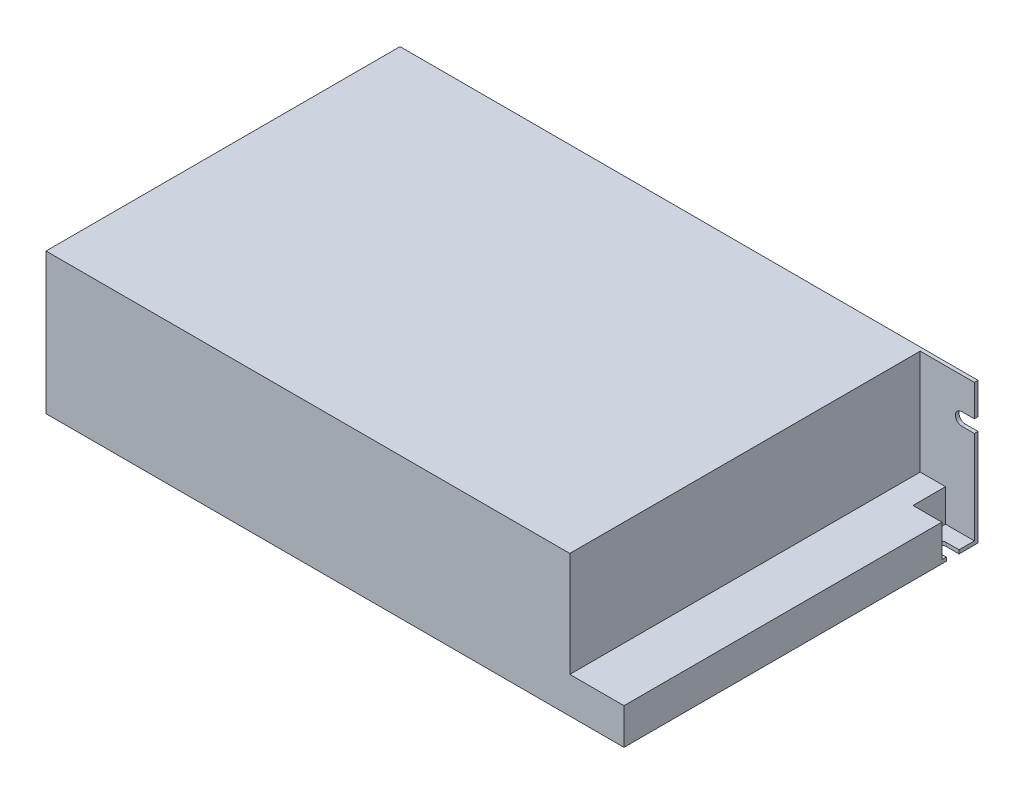
ISO-10303-21;
HEADER;
FILE_DESCRIPTION(('STEP AP214'),'2;1');
FILE_NAME('part.step','',(''),(''),'','','');
FILE_SCHEMA(('AUTOMOTIVE_DESIGN { 1 0 10303 214 1 1 1 1 }'));
ENDSEC;
DATA;
#1=APPLICATION_CONTEXT('core data for automotive mechanical design processes');
#2=APPLICATION_PROTOCOL_DEFINITION('international standard','automotive_design',2000,#1);
#3=PRODUCT_CONTEXT('',#1,'mechanical');
#4=PRODUCT('Part','Part','',(#3));
#5=PRODUCT_RELATED_PRODUCT_CATEGORY('part','',(#4));
#6=PRODUCT_DEFINITION_FORMATION('','',#4);
#7=PRODUCT_DEFINITION_CONTEXT('part definition',#1,'design');
#8=PRODUCT_DEFINITION('design','',#6,#7);
#9=PRODUCT_DEFINITION_SHAPE('','',#8);
#10=(LENGTH_UNIT() NAMED_UNIT(*) SI_UNIT(.MILLI.,.METRE.));
#11=(NAMED_UNIT(*) PLANE_ANGLE_UNIT() SI_UNIT($,.RADIAN.));
#12=(NAMED_UNIT(*) SI_UNIT($,.STERADIAN.) SOLID_ANGLE_UNIT());
#13=UNCERTAINTY_MEASURE_WITH_UNIT(LENGTH_MEASURE(1.E-05),#10,'distance_accuracy_value','');
#14=(GEOMETRIC_REPRESENTATION_CONTEXT(3) GLOBAL_UNCERTAINTY_ASSIGNED_CONTEXT((#13)) GLOBAL_UNIT_ASSIGNED_CONTEXT((#10,
#11,#12)) REPRESENTATION_CONTEXT('',''));
#15=CARTESIAN_POINT('',(0.,0.,0.));
#16=DIRECTION('',(0.,0.,1.));
#17=DIRECTION('',(1.,0.,0.));
#18=AXIS2_PLACEMENT_3D('',#15,#16,#17);
#19=CARTESIAN_POINT('',(80.,39.,-49.));
#20=DIRECTION('',(-1.,0.,0.));
#21=DIRECTION('',(0.,0.,1.));
#22=AXIS2_PLACEMENT_3D('',#19,#20,#21);
#23=PLANE('',#22);
#24=DIRECTION('',(0.,0.,1.));
#25=VECTOR('',#24,1.);
#26=CARTESIAN_POINT('',(80.,0.999999999999999,-48.));
#27=LINE('',#26,#25);
#28=CARTESIAN_POINT('',(80.,0.999999999999999,-40.25));
#29=VERTEX_POINT('',#28);
#30=CARTESIAN_POINT('',(80.,0.999999999999999,-39.));
#31=VERTEX_POINT('',#30);
#32=EDGE_CURVE('E319',#29,#31,#27,.T.);
#33=ORIENTED_EDGE('',*,*,#32,.T.);
#34=DIRECTION('',(0.,1.,0.));
#35=VECTOR('',#34,1.);
#36=CARTESIAN_POINT('',(80.,-12.0415945787923,-39.));
#37=LINE('',#36,#35);
#38=CARTESIAN_POINT('',(80.,10.,-39.));
#39=VERTEX_POINT('',#38);
#40=EDGE_CURVE('E318',#31,#39,#37,.T.);
#41=ORIENTED_EDGE('',*,*,#40,.T.);
#42=DIRECTION('',(0.,0.,-1.));
#43=VECTOR('',#42,1.);
#44=CARTESIAN_POINT('',(80.,10.,49.));
#45=LINE('',#44,#43);
#46=CARTESIAN_POINT('',(80.,10.,49.));
#47=VERTEX_POINT('',#46);
#48=EDGE_CURVE('E279',#47,#39,#45,.T.);
#49=ORIENTED_EDGE('',*,*,#48,.F.);
#50=DIRECTION('',(0.,-1.,0.));
#51=VECTOR('',#50,1.);
#52=CARTESIAN_POINT('',(80.,39.,49.));
#53=LINE('',#52,#51);
#54=CARTESIAN_POINT('',(80.,0.,49.));
#55=VERTEX_POINT('',#54);
#56=EDGE_CURVE('E220',#47,#55,#53,.T.);
#57=ORIENTED_EDGE('',*,*,#56,.T.);
#58=DIRECTION('',(0.,0.,-1.));
#59=VECTOR('',#58,1.);
#60=CARTESIAN_POINT('',(80.,0.,-49.));
#61=LINE('',#60,#59);
#62=CARTESIAN_POINT('',(80.,0.,-40.25));
#63=VERTEX_POINT('',#62);
#64=EDGE_CURVE('E198',#55,#63,#61,.T.);
#65=ORIENTED_EDGE('',*,*,#64,.T.);
#66=DIRECTION('',(0.,-1.,0.));
#67=VECTOR('',#66,1.);
#68=CARTESIAN_POINT('',(80.,5.,-40.25));
#69=LINE('',#68,#67);
#70=EDGE_CURVE('E314',#29,#63,#69,.T.);
#71=ORIENTED_EDGE('',*,*,#70,.F.);
#72=EDGE_LOOP('',(#33,#41,#49,#57,#65,#71));
#73=FACE_BOUND('',#72,.T.);
#74=ADVANCED_FACE('F31',(#73),#23,.F.);
#75=CARTESIAN_POINT('',(76.5,5.,-42.));
#76=DIRECTION('',(0.,-1.,0.));
#77=DIRECTION('',(0.,0.,-1.));
#78=AXIS2_PLACEMENT_3D('',#75,#76,#77);
#79=CYLINDRICAL_SURFACE('',#78,1.74999999999999);
#80=CARTESIAN_POINT('',(76.5,1.,-42.));
#81=DIRECTION('',(0.,1.,0.));
#82=DIRECTION('',(0.,0.,1.));
#83=AXIS2_PLACEMENT_3D('',#80,#81,#82);
#84=CIRCLE('',#83,1.74999999999999);
#85=CARTESIAN_POINT('',(76.5,1.,-40.25));
#86=VERTEX_POINT('',#85);
#87=CARTESIAN_POINT('',(76.5,1.,-43.75));
#88=VERTEX_POINT('',#87);
#89=EDGE_CURVE('E45',#86,#88,#84,.F.);
#90=ORIENTED_EDGE('',*,*,#89,.F.);
#91=DIRECTION('',(0.,-1.,0.));
#92=VECTOR('',#91,1.);
#93=CARTESIAN_POINT('',(76.5,5.,-40.25));
#94=LINE('',#93,#92);
#95=CARTESIAN_POINT('',(76.5,0.,-40.25));
#96=VERTEX_POINT('',#95);
#97=EDGE_CURVE('E338',#86,#96,#94,.T.);
#98=ORIENTED_EDGE('',*,*,#97,.T.);
#99=CARTESIAN_POINT('',(76.5,0.,-42.));
#100=DIRECTION('',(0.,-1.,0.));
#101=DIRECTION('',(0.,0.,-1.));
#102=AXIS2_PLACEMENT_3D('',#99,#100,#101);
#103=CIRCLE('',#102,1.74999999999999);
#104=CARTESIAN_POINT('',(76.5,0.,-43.75));
#105=VERTEX_POINT('',#104);
#106=EDGE_CURVE('E333',#96,#105,#103,.T.);
#107=ORIENTED_EDGE('',*,*,#106,.T.);
#108=DIRECTION('',(0.,-1.,0.));
#109=VECTOR('',#108,1.);
#110=CARTESIAN_POINT('',(76.5,5.,-43.75));
#111=LINE('',#110,#109);
#112=EDGE_CURVE('E52',#88,#105,#111,.T.);
#113=ORIENTED_EDGE('',*,*,#112,.F.);
#114=EDGE_LOOP('',(#90,#98,#107,#113));
#115=FACE_BOUND('',#114,.T.);
#116=ADVANCED_FACE('F406',(#115),#79,.F.);
#117=CARTESIAN_POINT('',(76.5,5.,-40.25));
#118=DIRECTION('',(0.,0.,1.));
#119=DIRECTION('',(1.,0.,0.));
#120=AXIS2_PLACEMENT_3D('',#117,#118,#119);
#121=PLANE('',#120);
#122=DIRECTION('',(-1.,0.,0.));
#123=VECTOR('',#122,1.);
#124=CARTESIAN_POINT('',(76.5,1.,-40.25));
#125=LINE('',#124,#123);
#126=EDGE_CURVE('E331',#29,#86,#125,.T.);
#127=ORIENTED_EDGE('',*,*,#126,.F.);
#128=ORIENTED_EDGE('',*,*,#70,.T.);
#129=DIRECTION('',(-1.,0.,0.));
#130=VECTOR('',#129,1.);
#131=CARTESIAN_POINT('',(76.5,0.,-40.25));
#132=LINE('',#131,#130);
#133=EDGE_CURVE('E310',#63,#96,#132,.T.);
#134=ORIENTED_EDGE('',*,*,#133,.T.);
#135=ORIENTED_EDGE('',*,*,#97,.F.);
#136=EDGE_LOOP('',(#127,#128,#134,#135));
#137=FACE_BOUND('',#136,.T.);
#138=ADVANCED_FACE('F399',(#137),#121,.F.);
#139=CARTESIAN_POINT('',(76.5,5.,-43.75));
#140=DIRECTION('',(0.,0.,-1.));
#141=DIRECTION('',(-1.,0.,0.));
#142=AXIS2_PLACEMENT_3D('',#139,#140,#141);
#143=PLANE('',#142);
#144=DIRECTION('',(1.,0.,0.));
#145=VECTOR('',#144,1.);
#146=CARTESIAN_POINT('',(76.5,1.,-43.75));
#147=LINE('',#146,#145);
#148=CARTESIAN_POINT('',(80.,0.999999999999999,-43.75));
#149=VERTEX_POINT('',#148);
#150=EDGE_CURVE('E12',#88,#149,#147,.T.);
#151=ORIENTED_EDGE('',*,*,#150,.F.);
#152=ORIENTED_EDGE('',*,*,#112,.T.);
#153=DIRECTION('',(1.,0.,0.));
#154=VECTOR('',#153,1.);
#155=CARTESIAN_POINT('',(76.5,0.,-43.75));
#156=LINE('',#155,#154);
#157=CARTESIAN_POINT('',(80.,0.,-43.75));
#158=VERTEX_POINT('',#157);
#159=EDGE_CURVE('E335',#105,#158,#156,.T.);
#160=ORIENTED_EDGE('',*,*,#159,.T.);
#161=DIRECTION('',(0.,-1.,0.));
#162=VECTOR('',#161,1.);
#163=CARTESIAN_POINT('',(80.,5.,-43.75));
#164=LINE('',#163,#162);
#165=EDGE_CURVE('E342',#149,#158,#164,.T.);
#166=ORIENTED_EDGE('',*,*,#165,.F.);
#167=EDGE_LOOP('',(#151,#152,#160,#166));
#168=FACE_BOUND('',#167,.T.);
#169=ADVANCED_FACE('F397',(#168),#143,.F.);
#170=DIRECTION('',(0.,1.,0.));
#171=VECTOR('',#170,1.);
#172=CARTESIAN_POINT('',(80.,39.,-48.));
#173=LINE('',#172,#171);
#174=CARTESIAN_POINT('',(80.,0.999999999999999,-48.));
#175=VERTEX_POINT('',#174);
#176=CARTESIAN_POINT('',(80.,26.75,-48.));
#177=VERTEX_POINT('',#176);
#178=EDGE_CURVE('E231',#175,#177,#173,.T.);
#179=ORIENTED_EDGE('',*,*,#178,.F.);
#180=EDGE_CURVE('E329',#175,#149,#27,.T.);
#181=ORIENTED_EDGE('',*,*,#180,.T.);
#182=ORIENTED_EDGE('',*,*,#165,.T.);
#183=CARTESIAN_POINT('',(80.,0.,-49.));
#184=VERTEX_POINT('',#183);
#185=EDGE_CURVE('E197',#158,#184,#61,.T.);
#186=ORIENTED_EDGE('',*,*,#185,.T.);
#187=DIRECTION('',(0.,-1.,0.));
#188=VECTOR('',#187,1.);
#189=CARTESIAN_POINT('',(80.,39.,-49.));
#190=LINE('',#189,#188);
#191=CARTESIAN_POINT('',(80.,26.75,-49.));
#192=VERTEX_POINT('',#191);
#193=EDGE_CURVE('E216',#192,#184,#190,.T.);
#194=ORIENTED_EDGE('',*,*,#193,.F.);
#195=DIRECTION('',(0.,0.,-1.));
#196=VECTOR('',#195,1.);
#197=CARTESIAN_POINT('',(80.,26.75,-44.));
#198=LINE('',#197,#196);
#199=EDGE_CURVE('E237',#177,#192,#198,.T.);
#200=ORIENTED_EDGE('',*,*,#199,.F.);
#201=EDGE_LOOP('',(#179,#181,#182,#186,#194,#200));
#202=FACE_BOUND('',#201,.T.);
#203=ADVANCED_FACE('F242',(#202),#23,.F.);
#204=CARTESIAN_POINT('',(-80.,39.,-49.));
#205=DIRECTION('',(1.,0.,0.));
#206=DIRECTION('',(0.,0.,-1.));
#207=AXIS2_PLACEMENT_3D('',#204,#205,#206);
#208=PLANE('',#207);
#209=DIRECTION('',(0.,0.,1.));
#210=VECTOR('',#209,1.);
#211=CARTESIAN_POINT('',(-80.,0.,-49.));
#212=LINE('',#211,#210);
#213=CARTESIAN_POINT('',(-80.,0.,-49.));
#214=VERTEX_POINT('',#213);
#215=CARTESIAN_POINT('',(-80.,0.,49.));
#216=VERTEX_POINT('',#215);
#217=EDGE_CURVE('E186',#214,#216,#212,.T.);
#218=ORIENTED_EDGE('',*,*,#217,.T.);
#219=DIRECTION('',(0.,-1.,0.));
#220=VECTOR('',#219,1.);
#221=CARTESIAN_POINT('',(-80.,39.,49.));
#222=LINE('',#221,#220);
#223=CARTESIAN_POINT('',(-80.,39.,49.));
#224=VERTEX_POINT('',#223);
#225=EDGE_CURVE('E222',#224,#216,#222,.T.);
#226=ORIENTED_EDGE('',*,*,#225,.F.);
#227=DIRECTION('',(0.,0.,1.));
#228=VECTOR('',#227,1.);
#229=CARTESIAN_POINT('',(-80.,39.,-49.));
#230=LINE('',#229,#228);
#231=CARTESIAN_POINT('',(-80.,39.,-49.));
#232=VERTEX_POINT('',#231);
#233=EDGE_CURVE('E203',#232,#224,#230,.T.);
#234=ORIENTED_EDGE('',*,*,#233,.F.);
#235=DIRECTION('',(0.,-1.,0.));
#236=VECTOR('',#235,1.);
#237=CARTESIAN_POINT('',(-80.,39.,-49.));
#238=LINE('',#237,#236);
#239=EDGE_CURVE('E213',#232,#214,#238,.T.);
#240=ORIENTED_EDGE('',*,*,#239,.T.);
#241=EDGE_LOOP('',(#218,#226,#234,#240));
#242=FACE_BOUND('',#241,.T.);
#243=ADVANCED_FACE('F33',(#242),#208,.F.);
#244=CARTESIAN_POINT('',(-80.,39.,49.));
#245=DIRECTION('',(0.,0.,-1.));
#246=DIRECTION('',(-1.,0.,0.));
#247=AXIS2_PLACEMENT_3D('',#244,#245,#246);
#248=PLANE('',#247);
#249=ORIENTED_EDGE('',*,*,#56,.F.);
#250=DIRECTION('',(1.,0.,0.));
#251=VECTOR('',#250,1.);
#252=CARTESIAN_POINT('',(65.,10.,49.));
#253=LINE('',#252,#251);
#254=CARTESIAN_POINT('',(65.,10.,49.));
#255=VERTEX_POINT('',#254);
#256=EDGE_CURVE('E183',#255,#47,#253,.T.);
#257=ORIENTED_EDGE('',*,*,#256,.F.);
#258=DIRECTION('',(0.,-1.,0.));
#259=VECTOR('',#258,1.);
#260=CARTESIAN_POINT('',(65.,39.,49.));
#261=LINE('',#260,#259);
#262=CARTESIAN_POINT('',(65.,39.,49.));
#263=VERTEX_POINT('',#262);
#264=EDGE_CURVE('E283',#263,#255,#261,.T.);
#265=ORIENTED_EDGE('',*,*,#264,.F.);
#266=DIRECTION('',(1.,0.,0.));
#267=VECTOR('',#266,1.);
#268=CARTESIAN_POINT('',(-80.,39.,49.));
#269=LINE('',#268,#267);
#270=EDGE_CURVE('E206',#224,#263,#269,.T.);
#271=ORIENTED_EDGE('',*,*,#270,.F.);
#272=ORIENTED_EDGE('',*,*,#225,.T.);
#273=DIRECTION('',(1.,0.,0.));
#274=VECTOR('',#273,1.);
#275=CARTESIAN_POINT('',(-80.,0.,49.));
#276=LINE('',#275,#274);
#277=EDGE_CURVE('E194',#216,#55,#276,.T.);
#278=ORIENTED_EDGE('',*,*,#277,.T.);
#279=EDGE_LOOP('',(#249,#257,#265,#271,#272,#278));
#280=FACE_BOUND('',#279,.T.);
#281=ADVANCED_FACE('F296',(#280),#248,.F.);
#282=CARTESIAN_POINT('',(80.,30.25,-48.));
#283=VERTEX_POINT('',#282);
#284=CARTESIAN_POINT('',(80.,39.,-48.));
#285=VERTEX_POINT('',#284);
#286=EDGE_CURVE('E281',#283,#285,#173,.T.);
#287=ORIENTED_EDGE('',*,*,#286,.F.);
#288=DIRECTION('',(0.,0.,-1.));
#289=VECTOR('',#288,1.);
#290=CARTESIAN_POINT('',(80.,30.25,-44.));
#291=LINE('',#290,#289);
#292=CARTESIAN_POINT('',(80.,30.25,-49.));
#293=VERTEX_POINT('',#292);
#294=EDGE_CURVE('E245',#283,#293,#291,.T.);
#295=ORIENTED_EDGE('',*,*,#294,.T.);
#296=CARTESIAN_POINT('',(80.,39.,-49.));
#297=VERTEX_POINT('',#296);
#298=EDGE_CURVE('E217',#297,#293,#190,.T.);
#299=ORIENTED_EDGE('',*,*,#298,.F.);
#300=DIRECTION('',(0.,0.,-1.));
#301=VECTOR('',#300,1.);
#302=CARTESIAN_POINT('',(80.,39.,-49.));
#303=LINE('',#302,#301);
#304=EDGE_CURVE('E209',#285,#297,#303,.T.);
#305=ORIENTED_EDGE('',*,*,#304,.F.);
#306=EDGE_LOOP('',(#287,#295,#299,#305));
#307=FACE_BOUND('',#306,.T.);
#308=ADVANCED_FACE('F390',(#307),#23,.F.);
#309=CARTESIAN_POINT('',(-80.,39.,-49.));
#310=DIRECTION('',(0.,0.,1.));
#311=DIRECTION('',(1.,0.,0.));
#312=AXIS2_PLACEMENT_3D('',#309,#310,#311);
#313=PLANE('',#312);
#314=CARTESIAN_POINT('',(59.,10.5,-49.));
#315=DIRECTION('',(0.,0.,-1.));
#316=DIRECTION('',(-1.,0.,0.));
#317=AXIS2_PLACEMENT_3D('',#314,#315,#316);
#318=CIRCLE('',#317,1.75);
#319=CARTESIAN_POINT('',(57.25,10.5,-49.));
#320=VERTEX_POINT('',#319);
#321=EDGE_CURVE('E247',#320,#320,#318,.T.);
#322=ORIENTED_EDGE('',*,*,#321,.F.);
#323=EDGE_LOOP('',(#322));
#324=FACE_BOUND('',#323,.T.);
#325=CARTESIAN_POINT('',(-58.,19.,-49.));
#326=DIRECTION('',(0.,0.,-1.));
#327=DIRECTION('',(-1.,0.,0.));
#328=AXIS2_PLACEMENT_3D('',#325,#326,#327);
#329=CIRCLE('',#328,1.75);
#330=CARTESIAN_POINT('',(-59.75,19.,-49.));
#331=VERTEX_POINT('',#330);
#332=EDGE_CURVE('E261',#331,#331,#329,.T.);
#333=ORIENTED_EDGE('',*,*,#332,.F.);
#334=EDGE_LOOP('',(#333));
#335=FACE_BOUND('',#334,.T.);
#336=CARTESIAN_POINT('',(-73.5,28.5,-49.));
#337=DIRECTION('',(0.,0.,-1.));
#338=DIRECTION('',(-1.,0.,0.));
#339=AXIS2_PLACEMENT_3D('',#336,#337,#338);
#340=CIRCLE('',#339,1.75);
#341=CARTESIAN_POINT('',(-75.25,28.5,-49.));
#342=VERTEX_POINT('',#341);
#343=EDGE_CURVE('E267',#342,#342,#340,.T.);
#344=ORIENTED_EDGE('',*,*,#343,.F.);
#345=EDGE_LOOP('',(#344));
#346=FACE_BOUND('',#345,.T.);
#347=CARTESIAN_POINT('',(59.,28.5,-49.));
#348=DIRECTION('',(0.,0.,-1.));
#349=DIRECTION('',(-1.,0.,0.));
#350=AXIS2_PLACEMENT_3D('',#347,#348,#349);
#351=CIRCLE('',#350,1.75);
#352=CARTESIAN_POINT('',(57.25,28.5,-49.));
#353=VERTEX_POINT('',#352);
#354=EDGE_CURVE('E273',#353,#353,#351,.T.);
#355=ORIENTED_EDGE('',*,*,#354,.F.);
#356=EDGE_LOOP('',(#355));
#357=FACE_BOUND('',#356,.T.);
#358=CARTESIAN_POINT('',(76.5,28.5,-49.));
#359=DIRECTION('',(0.,0.,-1.));
#360=DIRECTION('',(-1.,0.,0.));
#361=AXIS2_PLACEMENT_3D('',#358,#359,#360);
#362=CIRCLE('',#361,1.75);
#363=CARTESIAN_POINT('',(76.5,26.75,-49.));
#364=VERTEX_POINT('',#363);
#365=CARTESIAN_POINT('',(76.5,30.25,-49.));
#366=VERTEX_POINT('',#365);
#367=EDGE_CURVE('E374',#364,#366,#362,.T.);
#368=ORIENTED_EDGE('',*,*,#367,.F.);
#369=DIRECTION('',(-1.,0.,0.));
#370=VECTOR('',#369,1.);
#371=CARTESIAN_POINT('',(76.5,26.75,-49.));
#372=LINE('',#371,#370);
#373=EDGE_CURVE('E255',#192,#364,#372,.T.);
#374=ORIENTED_EDGE('',*,*,#373,.F.);
#375=ORIENTED_EDGE('',*,*,#193,.T.);
#376=DIRECTION('',(-1.,0.,0.));
#377=VECTOR('',#376,1.);
#378=CARTESIAN_POINT('',(-80.,0.,-49.));
#379=LINE('',#378,#377);
#380=EDGE_CURVE('E201',#184,#214,#379,.T.);
#381=ORIENTED_EDGE('',*,*,#380,.T.);
#382=ORIENTED_EDGE('',*,*,#239,.F.);
#383=DIRECTION('',(-1.,0.,0.));
#384=VECTOR('',#383,1.);
#385=CARTESIAN_POINT('',(-80.,39.,-49.));
#386=LINE('',#385,#384);
#387=EDGE_CURVE('E211',#297,#232,#386,.T.);
#388=ORIENTED_EDGE('',*,*,#387,.F.);
#389=ORIENTED_EDGE('',*,*,#298,.T.);
#390=DIRECTION('',(1.,0.,0.));
#391=VECTOR('',#390,1.);
#392=CARTESIAN_POINT('',(76.5,30.25,-49.));
#393=LINE('',#392,#391);
#394=EDGE_CURVE('E377',#366,#293,#393,.T.);
#395=ORIENTED_EDGE('',*,*,#394,.F.);
#396=EDGE_LOOP('',(#368,#374,#375,#381,#382,#388,#389,#395));
#397=FACE_BOUND('',#396,.T.);
#398=ADVANCED_FACE('F381',(#324,#335,#346,#357,#397),#313,.F.);
#399=CARTESIAN_POINT('',(-80.,39.,-49.));
#400=DIRECTION('',(0.,1.,0.));
#401=DIRECTION('',(0.,0.,1.));
#402=AXIS2_PLACEMENT_3D('',#399,#400,#401);
#403=PLANE('',#402);
#404=DIRECTION('',(1.,0.,0.));
#405=VECTOR('',#404,1.);
#406=CARTESIAN_POINT('',(65.,39.,-48.));
#407=LINE('',#406,#405);
#408=CARTESIAN_POINT('',(65.,39.,-48.));
#409=VERTEX_POINT('',#408);
#410=EDGE_CURVE('E182',#409,#285,#407,.T.);
#411=ORIENTED_EDGE('',*,*,#410,.T.);
#412=ORIENTED_EDGE('',*,*,#304,.T.);
#413=ORIENTED_EDGE('',*,*,#387,.T.);
#414=ORIENTED_EDGE('',*,*,#233,.T.);
#415=ORIENTED_EDGE('',*,*,#270,.T.);
#416=DIRECTION('',(0.,0.,1.));
#417=VECTOR('',#416,1.);
#418=CARTESIAN_POINT('',(65.,39.,49.));
#419=LINE('',#418,#417);
#420=EDGE_CURVE('E188',#409,#263,#419,.T.);
#421=ORIENTED_EDGE('',*,*,#420,.F.);
#422=EDGE_LOOP('',(#411,#412,#413,#414,#415,#421));
#423=FACE_BOUND('',#422,.T.);
#424=ADVANCED_FACE('F297',(#423),#403,.T.);
#425=CARTESIAN_POINT('',(-80.,0.,-49.));
#426=DIRECTION('',(0.,1.,0.));
#427=DIRECTION('',(0.,0.,1.));
#428=AXIS2_PLACEMENT_3D('',#425,#426,#427);
#429=PLANE('',#428);
#430=CARTESIAN_POINT('',(-75.5,0.,43.5));
#431=DIRECTION('',(0.,-1.,0.));
#432=DIRECTION('',(0.,0.,-1.));
#433=AXIS2_PLACEMENT_3D('',#430,#431,#432);
#434=CIRCLE('',#433,1.75);
#435=CARTESIAN_POINT('',(-75.5,0.,41.75));
#436=VERTEX_POINT('',#435);
#437=EDGE_CURVE('E340',#436,#436,#434,.T.);
#438=ORIENTED_EDGE('',*,*,#437,.F.);
#439=EDGE_LOOP('',(#438));
#440=FACE_BOUND('',#439,.T.);
#441=CARTESIAN_POINT('',(-56.,0.,16.));
#442=DIRECTION('',(0.,-1.,0.));
#443=DIRECTION('',(0.,0.,-1.));
#444=AXIS2_PLACEMENT_3D('',#441,#442,#443);
#445=CIRCLE('',#444,1.75);
#446=CARTESIAN_POINT('',(-56.,0.,14.25));
#447=VERTEX_POINT('',#446);
#448=EDGE_CURVE('E350',#447,#447,#445,.T.);
#449=ORIENTED_EDGE('',*,*,#448,.F.);
#450=EDGE_LOOP('',(#449));
#451=FACE_BOUND('',#450,.T.);
#452=CARTESIAN_POINT('',(-56.,0.,-16.));
#453=DIRECTION('',(0.,-1.,0.));
#454=DIRECTION('',(0.,0.,-1.));
#455=AXIS2_PLACEMENT_3D('',#452,#453,#454);
#456=CIRCLE('',#455,1.75);
#457=CARTESIAN_POINT('',(-56.,0.,-17.75));
#458=VERTEX_POINT('',#457);
#459=EDGE_CURVE('E356',#458,#458,#456,.T.);
#460=ORIENTED_EDGE('',*,*,#459,.F.);
#461=EDGE_LOOP('',(#460));
#462=FACE_BOUND('',#461,.T.);
#463=CARTESIAN_POINT('',(22.,0.,16.));
#464=DIRECTION('',(0.,-1.,0.));
#465=DIRECTION('',(0.,0.,-1.));
#466=AXIS2_PLACEMENT_3D('',#463,#464,#465);
#467=CIRCLE('',#466,1.75);
#468=CARTESIAN_POINT('',(22.,0.,14.25));
#469=VERTEX_POINT('',#468);
#470=EDGE_CURVE('E362',#469,#469,#467,.T.);
#471=ORIENTED_EDGE('',*,*,#470,.F.);
#472=EDGE_LOOP('',(#471));
#473=FACE_BOUND('',#472,.T.);
#474=CARTESIAN_POINT('',(22.,0.,-16.));
#475=DIRECTION('',(0.,-1.,0.));
#476=DIRECTION('',(0.,0.,-1.));
#477=AXIS2_PLACEMENT_3D('',#474,#475,#476);
#478=CIRCLE('',#477,1.75);
#479=CARTESIAN_POINT('',(22.,0.,-17.75));
#480=VERTEX_POINT('',#479);
#481=EDGE_CURVE('E368',#480,#480,#478,.T.);
#482=ORIENTED_EDGE('',*,*,#481,.F.);
#483=EDGE_LOOP('',(#482));
#484=FACE_BOUND('',#483,.T.);
#485=ORIENTED_EDGE('',*,*,#106,.F.);
#486=ORIENTED_EDGE('',*,*,#133,.F.);
#487=ORIENTED_EDGE('',*,*,#64,.F.);
#488=ORIENTED_EDGE('',*,*,#277,.F.);
#489=ORIENTED_EDGE('',*,*,#217,.F.);
#490=ORIENTED_EDGE('',*,*,#380,.F.);
#491=ORIENTED_EDGE('',*,*,#185,.F.);
#492=ORIENTED_EDGE('',*,*,#159,.F.);
#493=EDGE_LOOP('',(#485,#486,#487,#488,#489,#490,#491,#492));
#494=FACE_BOUND('',#493,.T.);
#495=ADVANCED_FACE('F308',(#440,#451,#462,#473,#484,#494),#429,.F.);
#496=CARTESIAN_POINT('',(65.,39.,-48.));
#497=DIRECTION('',(0.,0.,-1.));
#498=DIRECTION('',(-1.,0.,0.));
#499=AXIS2_PLACEMENT_3D('',#496,#497,#498);
#500=PLANE('',#499);
#501=ORIENTED_EDGE('',*,*,#178,.T.);
#502=DIRECTION('',(-1.,0.,0.));
#503=VECTOR('',#502,1.);
#504=CARTESIAN_POINT('',(65.,26.75,-48.));
#505=LINE('',#504,#503);
#506=CARTESIAN_POINT('',(76.5,26.75,-48.));
#507=VERTEX_POINT('',#506);
#508=EDGE_CURVE('E39',#177,#507,#505,.T.);
#509=ORIENTED_EDGE('',*,*,#508,.T.);
#510=CARTESIAN_POINT('',(76.5,28.5,-48.));
#511=DIRECTION('',(0.,0.,-1.));
#512=DIRECTION('',(-1.,0.,0.));
#513=AXIS2_PLACEMENT_3D('',#510,#511,#512);
#514=CIRCLE('',#513,1.75);
#515=CARTESIAN_POINT('',(76.5,30.25,-48.));
#516=VERTEX_POINT('',#515);
#517=EDGE_CURVE('E228',#507,#516,#514,.T.);
#518=ORIENTED_EDGE('',*,*,#517,.T.);
#519=DIRECTION('',(1.,0.,0.));
#520=VECTOR('',#519,1.);
#521=CARTESIAN_POINT('',(65.,30.25,-48.));
#522=LINE('',#521,#520);
#523=EDGE_CURVE('E225',#516,#283,#522,.T.);
#524=ORIENTED_EDGE('',*,*,#523,.T.);
#525=ORIENTED_EDGE('',*,*,#286,.T.);
#526=ORIENTED_EDGE('',*,*,#410,.F.);
#527=DIRECTION('',(0.,1.,0.));
#528=VECTOR('',#527,1.);
#529=CARTESIAN_POINT('',(65.,39.,-48.));
#530=LINE('',#529,#528);
#531=CARTESIAN_POINT('',(65.,10.,-48.));
#532=VERTEX_POINT('',#531);
#533=EDGE_CURVE('E180',#532,#409,#530,.T.);
#534=ORIENTED_EDGE('',*,*,#533,.F.);
#535=DIRECTION('',(1.,0.,0.));
#536=VECTOR('',#535,1.);
#537=CARTESIAN_POINT('',(65.,10.,-48.));
#538=LINE('',#537,#536);
#539=CARTESIAN_POINT('',(72.,10.,-48.));
#540=VERTEX_POINT('',#539);
#541=EDGE_CURVE('E174',#532,#540,#538,.T.);
#542=ORIENTED_EDGE('',*,*,#541,.T.);
#543=DIRECTION('',(0.,1.,0.));
#544=VECTOR('',#543,1.);
#545=CARTESIAN_POINT('',(72.,-12.0415945787923,-48.));
#546=LINE('',#545,#544);
#547=CARTESIAN_POINT('',(72.,0.999999999999999,-48.));
#548=VERTEX_POINT('',#547);
#549=EDGE_CURVE('E156',#548,#540,#546,.T.);
#550=ORIENTED_EDGE('',*,*,#549,.F.);
#551=DIRECTION('',(1.,0.,0.));
#552=VECTOR('',#551,1.);
#553=CARTESIAN_POINT('',(80.,0.999999999999999,-48.));
#554=LINE('',#553,#552);
#555=EDGE_CURVE('E327',#548,#175,#554,.T.);
#556=ORIENTED_EDGE('',*,*,#555,.T.);
#557=EDGE_LOOP('',(#501,#509,#518,#524,#525,#526,#534,#542,#550,#556));
#558=FACE_BOUND('',#557,.T.);
#559=ADVANCED_FACE('F178',(#558),#500,.F.);
#560=CARTESIAN_POINT('',(65.,10.,49.));
#561=DIRECTION('',(0.,-1.,0.));
#562=DIRECTION('',(0.,0.,-1.));
#563=AXIS2_PLACEMENT_3D('',#560,#561,#562);
#564=PLANE('',#563);
#565=ORIENTED_EDGE('',*,*,#48,.T.);
#566=DIRECTION('',(1.,0.,0.));
#567=VECTOR('',#566,1.);
#568=CARTESIAN_POINT('',(80.,10.,-39.));
#569=LINE('',#568,#567);
#570=CARTESIAN_POINT('',(72.,10.,-39.));
#571=VERTEX_POINT('',#570);
#572=EDGE_CURVE('E169',#571,#39,#569,.T.);
#573=ORIENTED_EDGE('',*,*,#572,.F.);
#574=DIRECTION('',(0.,0.,1.));
#575=VECTOR('',#574,1.);
#576=CARTESIAN_POINT('',(72.,10.,-48.));
#577=LINE('',#576,#575);
#578=EDGE_CURVE('E160',#540,#571,#577,.T.);
#579=ORIENTED_EDGE('',*,*,#578,.F.);
#580=ORIENTED_EDGE('',*,*,#541,.F.);
#581=DIRECTION('',(0.,0.,-1.));
#582=VECTOR('',#581,1.);
#583=CARTESIAN_POINT('',(65.,10.,49.));
#584=LINE('',#583,#582);
#585=EDGE_CURVE('E286',#255,#532,#584,.T.);
#586=ORIENTED_EDGE('',*,*,#585,.F.);
#587=ORIENTED_EDGE('',*,*,#256,.T.);
#588=EDGE_LOOP('',(#565,#573,#579,#580,#586,#587));
#589=FACE_BOUND('',#588,.T.);
#590=ADVANCED_FACE('F173',(#589),#564,.F.);
#591=CARTESIAN_POINT('',(65.,39.,49.));
#592=DIRECTION('',(1.,0.,0.));
#593=DIRECTION('',(0.,0.,-1.));
#594=AXIS2_PLACEMENT_3D('',#591,#592,#593);
#595=PLANE('',#594);
#596=ORIENTED_EDGE('',*,*,#264,.T.);
#597=ORIENTED_EDGE('',*,*,#585,.T.);
#598=ORIENTED_EDGE('',*,*,#533,.T.);
#599=ORIENTED_EDGE('',*,*,#420,.T.);
#600=EDGE_LOOP('',(#596,#597,#598,#599));
#601=FACE_BOUND('',#600,.T.);
#602=ADVANCED_FACE('F291',(#601),#595,.T.);
#603=CARTESIAN_POINT('',(59.,28.5,-44.));
#604=DIRECTION('',(0.,0.,-1.));
#605=DIRECTION('',(-1.,0.,0.));
#606=AXIS2_PLACEMENT_3D('',#603,#604,#605);
#607=CYLINDRICAL_SURFACE('',#606,1.75);
#608=CARTESIAN_POINT('',(59.,28.5,-44.));
#609=DIRECTION('',(0.,0.,-1.));
#610=DIRECTION('',(-1.,0.,0.));
#611=AXIS2_PLACEMENT_3D('',#608,#609,#610);
#612=CIRCLE('',#611,1.75);
#613=CARTESIAN_POINT('',(57.25,28.5,-44.));
#614=VERTEX_POINT('',#613);
#615=EDGE_CURVE('E276',#614,#614,#612,.T.);
#616=ORIENTED_EDGE('',*,*,#615,.F.);
#617=EDGE_LOOP('',(#616));
#618=FACE_BOUND('',#617,.T.);
#619=ORIENTED_EDGE('',*,*,#354,.T.);
#620=EDGE_LOOP('',(#619));
#621=FACE_BOUND('',#620,.T.);
#622=ADVANCED_FACE('F475',(#618,#621),#607,.F.);
#623=CARTESIAN_POINT('',(59.,28.5,-44.));
#624=DIRECTION('',(0.,0.,-1.));
#625=DIRECTION('',(-1.,0.,0.));
#626=AXIS2_PLACEMENT_3D('',#623,#624,#625);
#627=PLANE('',#626);
#628=ORIENTED_EDGE('',*,*,#615,.T.);
#629=EDGE_LOOP('',(#628));
#630=FACE_BOUND('',#629,.T.);
#631=ADVANCED_FACE('F485',(#630),#627,.T.);
#632=CARTESIAN_POINT('',(-73.5,28.5,-44.));
#633=DIRECTION('',(0.,0.,-1.));
#634=DIRECTION('',(-1.,0.,0.));
#635=AXIS2_PLACEMENT_3D('',#632,#633,#634);
#636=CYLINDRICAL_SURFACE('',#635,1.75);
#637=CARTESIAN_POINT('',(-73.5,28.5,-44.));
#638=DIRECTION('',(0.,0.,-1.));
#639=DIRECTION('',(-1.,0.,0.));
#640=AXIS2_PLACEMENT_3D('',#637,#638,#639);
#641=CIRCLE('',#640,1.75);
#642=CARTESIAN_POINT('',(-75.25,28.5,-44.));
#643=VERTEX_POINT('',#642);
#644=EDGE_CURVE('E270',#643,#643,#641,.T.);
#645=ORIENTED_EDGE('',*,*,#644,.F.);
#646=EDGE_LOOP('',(#645));
#647=FACE_BOUND('',#646,.T.);
#648=ORIENTED_EDGE('',*,*,#343,.T.);
#649=EDGE_LOOP('',(#648));
#650=FACE_BOUND('',#649,.T.);
#651=ADVANCED_FACE('F493',(#647,#650),#636,.F.);
#652=CARTESIAN_POINT('',(-73.5,28.5,-44.));
#653=DIRECTION('',(0.,0.,-1.));
#654=DIRECTION('',(-1.,0.,0.));
#655=AXIS2_PLACEMENT_3D('',#652,#653,#654);
#656=PLANE('',#655);
#657=ORIENTED_EDGE('',*,*,#644,.T.);
#658=EDGE_LOOP('',(#657));
#659=FACE_BOUND('',#658,.T.);
#660=ADVANCED_FACE('F501',(#659),#656,.T.);
#661=CARTESIAN_POINT('',(-58.,19.,-44.));
#662=DIRECTION('',(0.,0.,-1.));
#663=DIRECTION('',(-1.,0.,0.));
#664=AXIS2_PLACEMENT_3D('',#661,#662,#663);
#665=CYLINDRICAL_SURFACE('',#664,1.75);
#666=CARTESIAN_POINT('',(-58.,19.,-44.));
#667=DIRECTION('',(0.,0.,-1.));
#668=DIRECTION('',(-1.,0.,0.));
#669=AXIS2_PLACEMENT_3D('',#666,#667,#668);
#670=CIRCLE('',#669,1.75);
#671=CARTESIAN_POINT('',(-59.75,19.,-44.));
#672=VERTEX_POINT('',#671);
#673=EDGE_CURVE('E264',#672,#672,#670,.T.);
#674=ORIENTED_EDGE('',*,*,#673,.F.);
#675=EDGE_LOOP('',(#674));
#676=FACE_BOUND('',#675,.T.);
#677=ORIENTED_EDGE('',*,*,#332,.T.);
#678=EDGE_LOOP('',(#677));
#679=FACE_BOUND('',#678,.T.);
#680=ADVANCED_FACE('F509',(#676,#679),#665,.F.);
#681=CARTESIAN_POINT('',(-58.,19.,-44.));
#682=DIRECTION('',(0.,0.,-1.));
#683=DIRECTION('',(-1.,0.,0.));
#684=AXIS2_PLACEMENT_3D('',#681,#682,#683);
#685=PLANE('',#684);
#686=ORIENTED_EDGE('',*,*,#673,.T.);
#687=EDGE_LOOP('',(#686));
#688=FACE_BOUND('',#687,.T.);
#689=ADVANCED_FACE('F517',(#688),#685,.T.);
#690=CARTESIAN_POINT('',(59.,10.5,-44.));
#691=DIRECTION('',(0.,0.,-1.));
#692=DIRECTION('',(-1.,0.,0.));
#693=AXIS2_PLACEMENT_3D('',#690,#691,#692);
#694=CYLINDRICAL_SURFACE('',#693,1.75);
#695=CARTESIAN_POINT('',(59.,10.5,-44.));
#696=DIRECTION('',(0.,0.,-1.));
#697=DIRECTION('',(-1.,0.,0.));
#698=AXIS2_PLACEMENT_3D('',#695,#696,#697);
#699=CIRCLE('',#698,1.75);
#700=CARTESIAN_POINT('',(57.25,10.5,-44.));
#701=VERTEX_POINT('',#700);
#702=EDGE_CURVE('E258',#701,#701,#699,.T.);
#703=ORIENTED_EDGE('',*,*,#702,.F.);
#704=EDGE_LOOP('',(#703));
#705=FACE_BOUND('',#704,.T.);
#706=ORIENTED_EDGE('',*,*,#321,.T.);
#707=EDGE_LOOP('',(#706));
#708=FACE_BOUND('',#707,.T.);
#709=ADVANCED_FACE('F525',(#705,#708),#694,.F.);
#710=CARTESIAN_POINT('',(59.,10.5,-44.));
#711=DIRECTION('',(0.,0.,-1.));
#712=DIRECTION('',(-1.,0.,0.));
#713=AXIS2_PLACEMENT_3D('',#710,#711,#712);
#714=PLANE('',#713);
#715=ORIENTED_EDGE('',*,*,#702,.T.);
#716=EDGE_LOOP('',(#715));
#717=FACE_BOUND('',#716,.T.);
#718=ADVANCED_FACE('F533',(#717),#714,.T.);
#719=CARTESIAN_POINT('',(76.5,28.5,-44.));
#720=DIRECTION('',(0.,0.,-1.));
#721=DIRECTION('',(-1.,0.,0.));
#722=AXIS2_PLACEMENT_3D('',#719,#720,#721);
#723=CYLINDRICAL_SURFACE('',#722,1.75);
#724=DIRECTION('',(0.,0.,-1.));
#725=VECTOR('',#724,1.);
#726=CARTESIAN_POINT('',(76.5,26.75,-44.));
#727=LINE('',#726,#725);
#728=EDGE_CURVE('E239',#507,#364,#727,.T.);
#729=ORIENTED_EDGE('',*,*,#728,.T.);
#730=ORIENTED_EDGE('',*,*,#367,.T.);
#731=DIRECTION('',(0.,0.,-1.));
#732=VECTOR('',#731,1.);
#733=CARTESIAN_POINT('',(76.5,30.25,-44.));
#734=LINE('',#733,#732);
#735=EDGE_CURVE('E250',#516,#366,#734,.T.);
#736=ORIENTED_EDGE('',*,*,#735,.F.);
#737=ORIENTED_EDGE('',*,*,#517,.F.);
#738=EDGE_LOOP('',(#729,#730,#736,#737));
#739=FACE_BOUND('',#738,.T.);
#740=ADVANCED_FACE('F384',(#739),#723,.F.);
#741=CARTESIAN_POINT('',(76.5,26.75,-44.));
#742=DIRECTION('',(0.,-1.,0.));
#743=DIRECTION('',(0.,0.,-1.));
#744=AXIS2_PLACEMENT_3D('',#741,#742,#743);
#745=PLANE('',#744);
#746=ORIENTED_EDGE('',*,*,#199,.T.);
#747=ORIENTED_EDGE('',*,*,#373,.T.);
#748=ORIENTED_EDGE('',*,*,#728,.F.);
#749=ORIENTED_EDGE('',*,*,#508,.F.);
#750=EDGE_LOOP('',(#746,#747,#748,#749));
#751=FACE_BOUND('',#750,.T.);
#752=ADVANCED_FACE('F235',(#751),#745,.F.);
#753=CARTESIAN_POINT('',(76.5,30.25,-44.));
#754=DIRECTION('',(0.,1.,0.));
#755=DIRECTION('',(0.,0.,1.));
#756=AXIS2_PLACEMENT_3D('',#753,#754,#755);
#757=PLANE('',#756);
#758=ORIENTED_EDGE('',*,*,#735,.T.);
#759=ORIENTED_EDGE('',*,*,#394,.T.);
#760=ORIENTED_EDGE('',*,*,#294,.F.);
#761=ORIENTED_EDGE('',*,*,#523,.F.);
#762=EDGE_LOOP('',(#758,#759,#760,#761));
#763=FACE_BOUND('',#762,.T.);
#764=ADVANCED_FACE('F386',(#763),#757,.F.);
#765=CARTESIAN_POINT('',(22.,5.,-16.));
#766=DIRECTION('',(0.,-1.,0.));
#767=DIRECTION('',(0.,0.,-1.));
#768=AXIS2_PLACEMENT_3D('',#765,#766,#767);
#769=CYLINDRICAL_SURFACE('',#768,1.75);
#770=CARTESIAN_POINT('',(22.,5.,-16.));
#771=DIRECTION('',(0.,-1.,0.));
#772=DIRECTION('',(0.,0.,-1.));
#773=AXIS2_PLACEMENT_3D('',#770,#771,#772);
#774=CIRCLE('',#773,1.75);
#775=CARTESIAN_POINT('',(22.,5.,-17.75));
#776=VERTEX_POINT('',#775);
#777=EDGE_CURVE('E371',#776,#776,#774,.T.);
#778=ORIENTED_EDGE('',*,*,#777,.F.);
#779=EDGE_LOOP('',(#778));
#780=FACE_BOUND('',#779,.T.);
#781=ORIENTED_EDGE('',*,*,#481,.T.);
#782=EDGE_LOOP('',(#781));
#783=FACE_BOUND('',#782,.T.);
#784=ADVANCED_FACE('F559',(#780,#783),#769,.F.);
#785=CARTESIAN_POINT('',(22.,5.,-16.));
#786=DIRECTION('',(0.,-1.,0.));
#787=DIRECTION('',(0.,0.,-1.));
#788=AXIS2_PLACEMENT_3D('',#785,#786,#787);
#789=PLANE('',#788);
#790=ORIENTED_EDGE('',*,*,#777,.T.);
#791=EDGE_LOOP('',(#790));
#792=FACE_BOUND('',#791,.T.);
#793=ADVANCED_FACE('F565',(#792),#789,.T.);
#794=CARTESIAN_POINT('',(22.,5.,16.));
#795=DIRECTION('',(0.,-1.,0.));
#796=DIRECTION('',(0.,0.,-1.));
#797=AXIS2_PLACEMENT_3D('',#794,#795,#796);
#798=CYLINDRICAL_SURFACE('',#797,1.75);
#799=CARTESIAN_POINT('',(22.,5.,16.));
#800=DIRECTION('',(0.,-1.,0.));
#801=DIRECTION('',(0.,0.,-1.));
#802=AXIS2_PLACEMENT_3D('',#799,#800,#801);
#803=CIRCLE('',#802,1.75);
#804=CARTESIAN_POINT('',(22.,5.,14.25));
#805=VERTEX_POINT('',#804);
#806=EDGE_CURVE('E365',#805,#805,#803,.T.);
#807=ORIENTED_EDGE('',*,*,#806,.F.);
#808=EDGE_LOOP('',(#807));
#809=FACE_BOUND('',#808,.T.);
#810=ORIENTED_EDGE('',*,*,#470,.T.);
#811=EDGE_LOOP('',(#810));
#812=FACE_BOUND('',#811,.T.);
#813=ADVANCED_FACE('F573',(#809,#812),#798,.F.);
#814=CARTESIAN_POINT('',(22.,5.,16.));
#815=DIRECTION('',(0.,-1.,0.));
#816=DIRECTION('',(0.,0.,-1.));
#817=AXIS2_PLACEMENT_3D('',#814,#815,#816);
#818=PLANE('',#817);
#819=ORIENTED_EDGE('',*,*,#806,.T.);
#820=EDGE_LOOP('',(#819));
#821=FACE_BOUND('',#820,.T.);
#822=ADVANCED_FACE('F581',(#821),#818,.T.);
#823=CARTESIAN_POINT('',(-56.,5.,-16.));
#824=DIRECTION('',(0.,-1.,0.));
#825=DIRECTION('',(0.,0.,-1.));
#826=AXIS2_PLACEMENT_3D('',#823,#824,#825);
#827=CYLINDRICAL_SURFACE('',#826,1.75);
#828=CARTESIAN_POINT('',(-56.,5.,-16.));
#829=DIRECTION('',(0.,-1.,0.));
#830=DIRECTION('',(0.,0.,-1.));
#831=AXIS2_PLACEMENT_3D('',#828,#829,#830);
#832=CIRCLE('',#831,1.75);
#833=CARTESIAN_POINT('',(-56.,5.,-17.75));
#834=VERTEX_POINT('',#833);
#835=EDGE_CURVE('E359',#834,#834,#832,.T.);
#836=ORIENTED_EDGE('',*,*,#835,.F.);
#837=EDGE_LOOP('',(#836));
#838=FACE_BOUND('',#837,.T.);
#839=ORIENTED_EDGE('',*,*,#459,.T.);
#840=EDGE_LOOP('',(#839));
#841=FACE_BOUND('',#840,.T.);
#842=ADVANCED_FACE('F589',(#838,#841),#827,.F.);
#843=CARTESIAN_POINT('',(-56.,5.,-16.));
#844=DIRECTION('',(0.,-1.,0.));
#845=DIRECTION('',(0.,0.,-1.));
#846=AXIS2_PLACEMENT_3D('',#843,#844,#845);
#847=PLANE('',#846);
#848=ORIENTED_EDGE('',*,*,#835,.T.);
#849=EDGE_LOOP('',(#848));
#850=FACE_BOUND('',#849,.T.);
#851=ADVANCED_FACE('F597',(#850),#847,.T.);
#852=CARTESIAN_POINT('',(-56.,5.,16.));
#853=DIRECTION('',(0.,-1.,0.));
#854=DIRECTION('',(0.,0.,-1.));
#855=AXIS2_PLACEMENT_3D('',#852,#853,#854);
#856=CYLINDRICAL_SURFACE('',#855,1.75);
#857=CARTESIAN_POINT('',(-56.,5.,16.));
#858=DIRECTION('',(0.,-1.,0.));
#859=DIRECTION('',(0.,0.,-1.));
#860=AXIS2_PLACEMENT_3D('',#857,#858,#859);
#861=CIRCLE('',#860,1.75);
#862=CARTESIAN_POINT('',(-56.,5.,14.25));
#863=VERTEX_POINT('',#862);
#864=EDGE_CURVE('E353',#863,#863,#861,.T.);
#865=ORIENTED_EDGE('',*,*,#864,.F.);
#866=EDGE_LOOP('',(#865));
#867=FACE_BOUND('',#866,.T.);
#868=ORIENTED_EDGE('',*,*,#448,.T.);
#869=EDGE_LOOP('',(#868));
#870=FACE_BOUND('',#869,.T.);
#871=ADVANCED_FACE('F605',(#867,#870),#856,.F.);
#872=CARTESIAN_POINT('',(-56.,5.,16.));
#873=DIRECTION('',(0.,-1.,0.));
#874=DIRECTION('',(0.,0.,-1.));
#875=AXIS2_PLACEMENT_3D('',#872,#873,#874);
#876=PLANE('',#875);
#877=ORIENTED_EDGE('',*,*,#864,.T.);
#878=EDGE_LOOP('',(#877));
#879=FACE_BOUND('',#878,.T.);
#880=ADVANCED_FACE('F613',(#879),#876,.T.);
#881=CARTESIAN_POINT('',(-75.5,5.,43.5));
#882=DIRECTION('',(0.,-1.,0.));
#883=DIRECTION('',(0.,0.,-1.));
#884=AXIS2_PLACEMENT_3D('',#881,#882,#883);
#885=CYLINDRICAL_SURFACE('',#884,1.75);
#886=CARTESIAN_POINT('',(-75.5,5.,43.5));
#887=DIRECTION('',(0.,-1.,0.));
#888=DIRECTION('',(0.,0.,-1.));
#889=AXIS2_PLACEMENT_3D('',#886,#887,#888);
#890=CIRCLE('',#889,1.75);
#891=CARTESIAN_POINT('',(-75.5,5.,41.75));
#892=VERTEX_POINT('',#891);
#893=EDGE_CURVE('E347',#892,#892,#890,.T.);
#894=ORIENTED_EDGE('',*,*,#893,.F.);
#895=EDGE_LOOP('',(#894));
#896=FACE_BOUND('',#895,.T.);
#897=ORIENTED_EDGE('',*,*,#437,.T.);
#898=EDGE_LOOP('',(#897));
#899=FACE_BOUND('',#898,.T.);
#900=ADVANCED_FACE('F621',(#896,#899),#885,.F.);
#901=CARTESIAN_POINT('',(-75.5,5.,43.5));
#902=DIRECTION('',(0.,-1.,0.));
#903=DIRECTION('',(0.,0.,-1.));
#904=AXIS2_PLACEMENT_3D('',#901,#902,#903);
#905=PLANE('',#904);
#906=ORIENTED_EDGE('',*,*,#893,.T.);
#907=EDGE_LOOP('',(#906));
#908=FACE_BOUND('',#907,.T.);
#909=ADVANCED_FACE('F629',(#908),#905,.T.);
#910=CARTESIAN_POINT('',(-80.,1.,-49.));
#911=DIRECTION('',(0.,1.,0.));
#912=DIRECTION('',(0.,0.,1.));
#913=AXIS2_PLACEMENT_3D('',#910,#911,#912);
#914=PLANE('',#913);
#915=ORIENTED_EDGE('',*,*,#126,.T.);
#916=ORIENTED_EDGE('',*,*,#89,.T.);
#917=ORIENTED_EDGE('',*,*,#150,.T.);
#918=ORIENTED_EDGE('',*,*,#180,.F.);
#919=ORIENTED_EDGE('',*,*,#555,.F.);
#920=DIRECTION('',(0.,0.,-1.));
#921=VECTOR('',#920,1.);
#922=CARTESIAN_POINT('',(72.,0.999999999999999,-48.));
#923=LINE('',#922,#921);
#924=CARTESIAN_POINT('',(72.,0.999999999999999,-39.));
#925=VERTEX_POINT('',#924);
#926=EDGE_CURVE('E163',#925,#548,#923,.T.);
#927=ORIENTED_EDGE('',*,*,#926,.F.);
#928=DIRECTION('',(-1.,0.,0.));
#929=VECTOR('',#928,1.);
#930=CARTESIAN_POINT('',(80.,0.999999999999999,-39.));
#931=LINE('',#930,#929);
#932=EDGE_CURVE('E322',#31,#925,#931,.T.);
#933=ORIENTED_EDGE('',*,*,#932,.F.);
#934=ORIENTED_EDGE('',*,*,#32,.F.);
#935=EDGE_LOOP('',(#915,#916,#917,#918,#919,#927,#933,#934));
#936=FACE_BOUND('',#935,.T.);
#937=ADVANCED_FACE('F635',(#936),#914,.T.);
#938=CARTESIAN_POINT('',(80.,-12.0415945787923,-39.));
#939=DIRECTION('',(0.,0.,1.));
#940=DIRECTION('',(0.,-1.,0.));
#941=AXIS2_PLACEMENT_3D('',#938,#939,#940);
#942=PLANE('',#941);
#943=ORIENTED_EDGE('',*,*,#932,.T.);
#944=DIRECTION('',(0.,1.,0.));
#945=VECTOR('',#944,1.);
#946=CARTESIAN_POINT('',(72.,-12.0415945787923,-39.));
#947=LINE('',#946,#945);
#948=EDGE_CURVE('E168',#925,#571,#947,.T.);
#949=ORIENTED_EDGE('',*,*,#948,.T.);
#950=ORIENTED_EDGE('',*,*,#572,.T.);
#951=ORIENTED_EDGE('',*,*,#40,.F.);
#952=EDGE_LOOP('',(#943,#949,#950,#951));
#953=FACE_BOUND('',#952,.T.);
#954=ADVANCED_FACE('F651',(#953),#942,.F.);
#955=CARTESIAN_POINT('',(72.,-12.0415945787923,-48.));
#956=DIRECTION('',(-1.,0.,0.));
#957=DIRECTION('',(0.,-1.,0.));
#958=AXIS2_PLACEMENT_3D('',#955,#956,#957);
#959=PLANE('',#958);
#960=ORIENTED_EDGE('',*,*,#926,.T.);
#961=ORIENTED_EDGE('',*,*,#549,.T.);
#962=ORIENTED_EDGE('',*,*,#578,.T.);
#963=ORIENTED_EDGE('',*,*,#948,.F.);
#964=EDGE_LOOP('',(#960,#961,#962,#963));
#965=FACE_BOUND('',#964,.T.);
#966=ADVANCED_FACE('F158',(#965),#959,.F.);
#967=CLOSED_SHELL('',(#74,#116,#138,#169,#203,#243,#281,#308,#398,#424,#495,#559,#590,#602,#622,
#631,#651,#660,#680,#689,#709,#718,#740,#752,#764,#784,#793,#813,#822,#842,#851,#871,#880,#900,
#909,#937,#954,#966));
#968=MANIFOLD_SOLID_BREP('B2',#967);
#969=ADVANCED_BREP_SHAPE_REPRESENTATION('',(#18,#968),#14);
#970=SHAPE_DEFINITION_REPRESENTATION(#9,#969);
ENDSEC;
END-ISO-10303-21;
